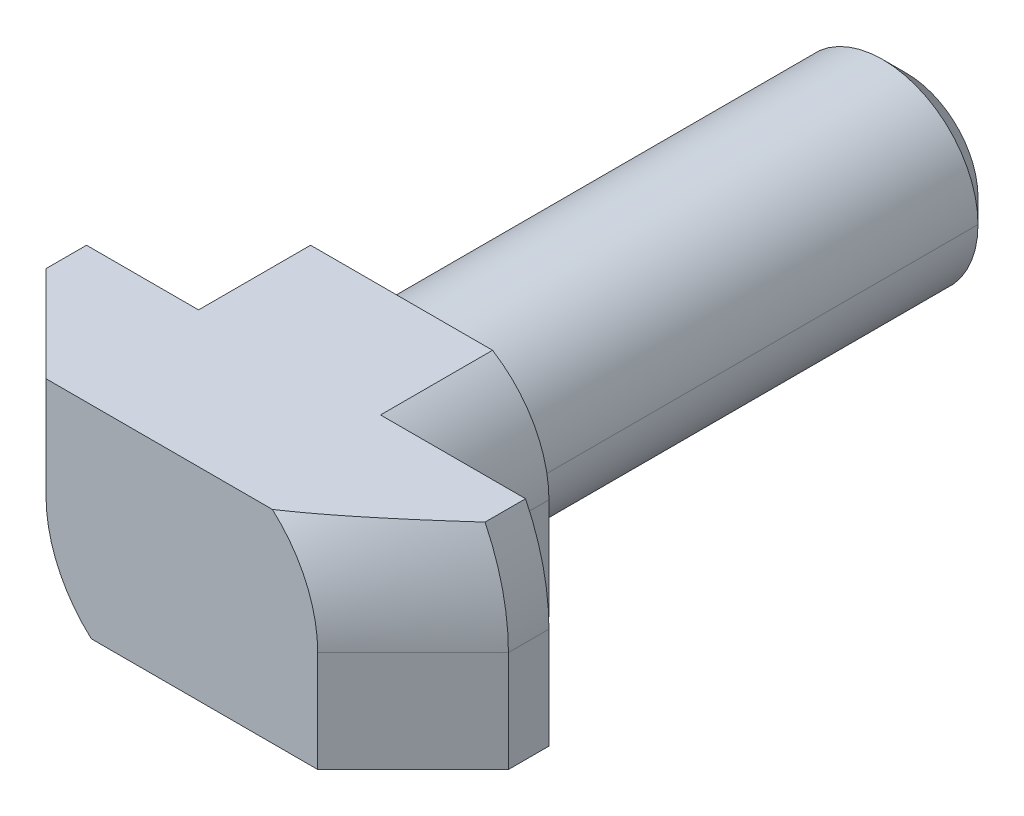
ISO-10303-21;
HEADER;
FILE_DESCRIPTION(('STEP AP214'),'2;1');
FILE_NAME('part.step','',(''),(''),'','','');
FILE_SCHEMA(('AUTOMOTIVE_DESIGN { 1 0 10303 214 1 1 1 1 }'));
ENDSEC;
DATA;
#1=APPLICATION_CONTEXT('core data for automotive mechanical design processes');
#2=APPLICATION_PROTOCOL_DEFINITION('international standard','automotive_design',2000,#1);
#3=PRODUCT_CONTEXT('',#1,'mechanical');
#4=PRODUCT('Part','Part','',(#3));
#5=PRODUCT_RELATED_PRODUCT_CATEGORY('part','',(#4));
#6=PRODUCT_DEFINITION_FORMATION('','',#4);
#7=PRODUCT_DEFINITION_CONTEXT('part definition',#1,'design');
#8=PRODUCT_DEFINITION('design','',#6,#7);
#9=PRODUCT_DEFINITION_SHAPE('','',#8);
#10=(LENGTH_UNIT() NAMED_UNIT(*) SI_UNIT(.MILLI.,.METRE.));
#11=(NAMED_UNIT(*) PLANE_ANGLE_UNIT() SI_UNIT($,.RADIAN.));
#12=(NAMED_UNIT(*) SI_UNIT($,.STERADIAN.) SOLID_ANGLE_UNIT());
#13=UNCERTAINTY_MEASURE_WITH_UNIT(LENGTH_MEASURE(1.E-05),#10,'distance_accuracy_value','');
#14=(GEOMETRIC_REPRESENTATION_CONTEXT(3) GLOBAL_UNCERTAINTY_ASSIGNED_CONTEXT((#13)) GLOBAL_UNIT_ASSIGNED_CONTEXT((#10,
#11,#12)) REPRESENTATION_CONTEXT('',''));
#15=CARTESIAN_POINT('',(0.,0.,0.));
#16=DIRECTION('',(0.,0.,1.));
#17=DIRECTION('',(1.,0.,0.));
#18=AXIS2_PLACEMENT_3D('',#15,#16,#17);
#19=CARTESIAN_POINT('',(0.,0.,-3.5));
#20=DIRECTION('',(0.,0.,-1.));
#21=DIRECTION('',(1.,0.,0.));
#22=AXIS2_PLACEMENT_3D('',#19,#20,#21);
#23=CYLINDRICAL_SURFACE('',#22,4.);
#24=DIRECTION('',(0.,0.,-1.));
#25=VECTOR('',#24,1.);
#26=CARTESIAN_POINT('',(4.,0.,-4.7));
#27=LINE('',#26,#25);
#28=CARTESIAN_POINT('',(4.,0.,-4.7));
#29=VERTEX_POINT('',#28);
#30=CARTESIAN_POINT('',(4.,0.,-23.7));
#31=VERTEX_POINT('',#30);
#32=EDGE_CURVE('E286',#29,#31,#27,.T.);
#33=ORIENTED_EDGE('',*,*,#32,.T.);
#34=CARTESIAN_POINT('',(0.,0.,-23.7));
#35=DIRECTION('',(0.,0.,-1.));
#36=DIRECTION('',(-1.,0.,0.));
#37=AXIS2_PLACEMENT_3D('',#34,#35,#36);
#38=CIRCLE('',#37,4.);
#39=CARTESIAN_POINT('',(-4.,0.,-23.7));
#40=VERTEX_POINT('',#39);
#41=EDGE_CURVE('E56',#31,#40,#38,.F.);
#42=ORIENTED_EDGE('',*,*,#41,.T.);
#43=DIRECTION('',(0.,0.,-1.));
#44=VECTOR('',#43,1.);
#45=CARTESIAN_POINT('',(-4.,0.,-4.7));
#46=LINE('',#45,#44);
#47=CARTESIAN_POINT('',(-4.,0.,-4.7));
#48=VERTEX_POINT('',#47);
#49=EDGE_CURVE('E281',#48,#40,#46,.T.);
#50=ORIENTED_EDGE('',*,*,#49,.F.);
#51=CARTESIAN_POINT('',(0.,0.,-4.7));
#52=DIRECTION('',(0.,0.,1.));
#53=DIRECTION('',(1.,0.,0.));
#54=AXIS2_PLACEMENT_3D('',#51,#52,#53);
#55=CIRCLE('',#54,4.);
#56=EDGE_CURVE('E284',#29,#48,#55,.T.);
#57=ORIENTED_EDGE('',*,*,#56,.F.);
#58=EDGE_LOOP('',(#33,#42,#50,#57));
#59=FACE_BOUND('',#58,.T.);
#60=ADVANCED_FACE('F46',(#59),#23,.T.);
#61=CARTESIAN_POINT('',(0.,0.,-3.5));
#62=DIRECTION('',(0.,0.,-1.));
#63=DIRECTION('',(1.,0.,0.));
#64=AXIS2_PLACEMENT_3D('',#61,#62,#63);
#65=CYLINDRICAL_SURFACE('',#64,4.);
#66=ORIENTED_EDGE('',*,*,#49,.T.);
#67=CARTESIAN_POINT('',(0.,0.,-23.7));
#68=DIRECTION('',(0.,0.,-1.));
#69=DIRECTION('',(-1.,0.,0.));
#70=AXIS2_PLACEMENT_3D('',#67,#68,#69);
#71=CIRCLE('',#70,4.);
#72=EDGE_CURVE('E13',#40,#31,#71,.F.);
#73=ORIENTED_EDGE('',*,*,#72,.T.);
#74=ORIENTED_EDGE('',*,*,#32,.F.);
#75=CARTESIAN_POINT('',(0.,0.,-4.7));
#76=DIRECTION('',(0.,0.,1.));
#77=DIRECTION('',(1.,0.,0.));
#78=AXIS2_PLACEMENT_3D('',#75,#76,#77);
#79=CIRCLE('',#78,4.);
#80=EDGE_CURVE('E285',#48,#29,#79,.T.);
#81=ORIENTED_EDGE('',*,*,#80,.F.);
#82=EDGE_LOOP('',(#66,#73,#74,#81));
#83=FACE_BOUND('',#82,.T.);
#84=ADVANCED_FACE('F419',(#83),#65,.T.);
#85=CARTESIAN_POINT('',(-5.,-4.25,-3.5));
#86=DIRECTION('',(-1.,0.,0.));
#87=DIRECTION('',(0.,0.,1.));
#88=AXIS2_PLACEMENT_3D('',#85,#86,#87);
#89=PLANE('',#88);
#90=DIRECTION('',(0.,0.,1.));
#91=VECTOR('',#90,1.);
#92=CARTESIAN_POINT('',(-5.,4.25,-1.75));
#93=LINE('',#92,#91);
#94=CARTESIAN_POINT('',(-5.,4.25,-4.7));
#95=VERTEX_POINT('',#94);
#96=CARTESIAN_POINT('',(-5.,4.25,0.));
#97=VERTEX_POINT('',#96);
#98=EDGE_CURVE('E252',#95,#97,#93,.T.);
#99=ORIENTED_EDGE('',*,*,#98,.F.);
#100=DIRECTION('',(0.,1.,0.));
#101=VECTOR('',#100,1.);
#102=CARTESIAN_POINT('',(-5.,-4.25,-4.7));
#103=LINE('',#102,#101);
#104=CARTESIAN_POINT('',(-5.,0.,-4.7));
#105=VERTEX_POINT('',#104);
#106=EDGE_CURVE('E709',#105,#95,#103,.T.);
#107=ORIENTED_EDGE('',*,*,#106,.F.);
#108=DIRECTION('',(0.,0.,-1.));
#109=VECTOR('',#108,1.);
#110=CARTESIAN_POINT('',(-5.,0.,-3.96));
#111=LINE('',#110,#109);
#112=CARTESIAN_POINT('',(-5.,0.,0.));
#113=VERTEX_POINT('',#112);
#114=EDGE_CURVE('E266',#113,#105,#111,.T.);
#115=ORIENTED_EDGE('',*,*,#114,.F.);
#116=DIRECTION('',(0.,-1.,0.));
#117=VECTOR('',#116,1.);
#118=CARTESIAN_POINT('',(-5.,-4.25,0.));
#119=LINE('',#118,#117);
#120=EDGE_CURVE('E274',#97,#113,#119,.T.);
#121=ORIENTED_EDGE('',*,*,#120,.F.);
#122=EDGE_LOOP('',(#99,#107,#115,#121));
#123=FACE_BOUND('',#122,.T.);
#124=ADVANCED_FACE('F426',(#123),#89,.T.);
#125=CARTESIAN_POINT('',(-9.7,-4.25,0.));
#126=DIRECTION('',(-1.,0.,0.));
#127=DIRECTION('',(0.,0.,1.));
#128=AXIS2_PLACEMENT_3D('',#125,#126,#127);
#129=PLANE('',#128);
#130=DIRECTION('',(0.,0.,1.));
#131=VECTOR('',#130,1.);
#132=CARTESIAN_POINT('',(-9.7,4.25,0.));
#133=LINE('',#132,#131);
#134=CARTESIAN_POINT('',(-9.7,4.25,0.));
#135=VERTEX_POINT('',#134);
#136=CARTESIAN_POINT('',(-9.7,4.25,1.7));
#137=VERTEX_POINT('',#136);
#138=EDGE_CURVE('E244',#135,#137,#133,.T.);
#139=ORIENTED_EDGE('',*,*,#138,.F.);
#140=DIRECTION('',(0.,1.,0.));
#141=VECTOR('',#140,1.);
#142=CARTESIAN_POINT('',(-9.7,-4.25,0.));
#143=LINE('',#142,#141);
#144=CARTESIAN_POINT('',(-9.7,0.,0.));
#145=VERTEX_POINT('',#144);
#146=EDGE_CURVE('E365',#145,#135,#143,.T.);
#147=ORIENTED_EDGE('',*,*,#146,.F.);
#148=DIRECTION('',(0.,0.,-1.));
#149=VECTOR('',#148,1.);
#150=CARTESIAN_POINT('',(-9.7,0.,-3.96));
#151=LINE('',#150,#149);
#152=CARTESIAN_POINT('',(-9.7,0.,1.7));
#153=VERTEX_POINT('',#152);
#154=EDGE_CURVE('E341',#153,#145,#151,.T.);
#155=ORIENTED_EDGE('',*,*,#154,.F.);
#156=DIRECTION('',(0.,-1.,0.));
#157=VECTOR('',#156,1.);
#158=CARTESIAN_POINT('',(-9.7,-4.25,1.7));
#159=LINE('',#158,#157);
#160=EDGE_CURVE('E293',#137,#153,#159,.T.);
#161=ORIENTED_EDGE('',*,*,#160,.F.);
#162=EDGE_LOOP('',(#139,#147,#155,#161));
#163=FACE_BOUND('',#162,.T.);
#164=ADVANCED_FACE('F471',(#163),#129,.T.);
#165=CARTESIAN_POINT('',(-9.7,-4.25,1.7));
#166=DIRECTION('',(-0.707106781186547,0.,0.707106781186548));
#167=DIRECTION('',(0.,1.,0.));
#168=AXIS2_PLACEMENT_3D('',#165,#166,#167);
#169=PLANE('',#168);
#170=DIRECTION('',(0.707106781186548,0.,0.707106781186547));
#171=VECTOR('',#170,1.);
#172=CARTESIAN_POINT('',(-7.7,4.25,3.7));
#173=LINE('',#172,#171);
#174=CARTESIAN_POINT('',(-5.7,4.25,5.7));
#175=VERTEX_POINT('',#174);
#176=EDGE_CURVE('E238',#137,#175,#173,.T.);
#177=ORIENTED_EDGE('',*,*,#176,.F.);
#178=ORIENTED_EDGE('',*,*,#160,.T.);
#179=DIRECTION('',(-0.707106781186548,0.,-0.707106781186547));
#180=VECTOR('',#179,1.);
#181=CARTESIAN_POINT('',(-9.7848562079907,0.,1.61514379200929));
#182=LINE('',#181,#180);
#183=CARTESIAN_POINT('',(-5.7,0.,5.7));
#184=VERTEX_POINT('',#183);
#185=EDGE_CURVE('E329',#184,#153,#182,.T.);
#186=ORIENTED_EDGE('',*,*,#185,.F.);
#187=DIRECTION('',(0.,-1.,0.));
#188=VECTOR('',#187,1.);
#189=CARTESIAN_POINT('',(-5.7,-4.25,5.7));
#190=LINE('',#189,#188);
#191=EDGE_CURVE('E306',#175,#184,#190,.T.);
#192=ORIENTED_EDGE('',*,*,#191,.F.);
#193=EDGE_LOOP('',(#177,#178,#186,#192));
#194=FACE_BOUND('',#193,.T.);
#195=ADVANCED_FACE('F466',(#194),#169,.T.);
#196=CARTESIAN_POINT('',(0.,-4.25,0.));
#197=DIRECTION('',(0.,1.,0.));
#198=DIRECTION('',(0.,0.,-1.));
#199=AXIS2_PLACEMENT_3D('',#196,#197,#198);
#200=PLANE('',#199);
#201=DIRECTION('',(1.,0.,0.));
#202=VECTOR('',#201,1.);
#203=CARTESIAN_POINT('',(-2.5,-4.25,0.));
#204=LINE('',#203,#202);
#205=CARTESIAN_POINT('',(-8.71937497760017,-4.25,0.));
#206=VERTEX_POINT('',#205);
#207=CARTESIAN_POINT('',(-2.63391343821318,-4.25,0.));
#208=VERTEX_POINT('',#207);
#209=EDGE_CURVE('E277',#206,#208,#204,.T.);
#210=ORIENTED_EDGE('',*,*,#209,.T.);
#211=DIRECTION('',(0.,0.,1.));
#212=VECTOR('',#211,1.);
#213=CARTESIAN_POINT('',(-2.63391343821318,-4.25,-3.96));
#214=LINE('',#213,#212);
#215=CARTESIAN_POINT('',(-2.63391343821318,-4.25,-4.7));
#216=VERTEX_POINT('',#215);
#217=EDGE_CURVE('E301',#216,#208,#214,.T.);
#218=ORIENTED_EDGE('',*,*,#217,.F.);
#219=DIRECTION('',(-1.,0.,0.));
#220=VECTOR('',#219,1.);
#221=CARTESIAN_POINT('',(-2.125,-4.25,-4.7));
#222=LINE('',#221,#220);
#223=CARTESIAN_POINT('',(5.,-4.25,-4.7));
#224=VERTEX_POINT('',#223);
#225=EDGE_CURVE('E267',#224,#216,#222,.T.);
#226=ORIENTED_EDGE('',*,*,#225,.F.);
#227=DIRECTION('',(0.,0.,1.));
#228=VECTOR('',#227,1.);
#229=CARTESIAN_POINT('',(5.,-4.25,0.));
#230=LINE('',#229,#228);
#231=CARTESIAN_POINT('',(5.,-4.25,0.));
#232=VERTEX_POINT('',#231);
#233=EDGE_CURVE('E260',#224,#232,#230,.T.);
#234=ORIENTED_EDGE('',*,*,#233,.T.);
#235=DIRECTION('',(1.,0.,0.));
#236=VECTOR('',#235,1.);
#237=CARTESIAN_POINT('',(4.85,-4.25,0.));
#238=LINE('',#237,#236);
#239=CARTESIAN_POINT('',(9.7,-4.25,0.));
#240=VERTEX_POINT('',#239);
#241=EDGE_CURVE('E314',#232,#240,#238,.T.);
#242=ORIENTED_EDGE('',*,*,#241,.T.);
#243=DIRECTION('',(0.,0.,1.));
#244=VECTOR('',#243,1.);
#245=CARTESIAN_POINT('',(9.7,-4.25,0.85));
#246=LINE('',#245,#244);
#247=CARTESIAN_POINT('',(9.7,-4.25,1.7));
#248=VERTEX_POINT('',#247);
#249=EDGE_CURVE('E272',#240,#248,#246,.T.);
#250=ORIENTED_EDGE('',*,*,#249,.T.);
#251=DIRECTION('',(-0.707106781186548,0.,0.707106781186547));
#252=VECTOR('',#251,1.);
#253=CARTESIAN_POINT('',(5.7,-4.25,5.7));
#254=LINE('',#253,#252);
#255=CARTESIAN_POINT('',(5.7,-4.25,5.7));
#256=VERTEX_POINT('',#255);
#257=EDGE_CURVE('E273',#248,#256,#254,.T.);
#258=ORIENTED_EDGE('',*,*,#257,.T.);
#259=DIRECTION('',(-1.,0.,0.));
#260=VECTOR('',#259,1.);
#261=CARTESIAN_POINT('',(-2.85,-4.25,5.7));
#262=LINE('',#261,#260);
#263=CARTESIAN_POINT('',(-3.79835490706173,-4.25,5.7));
#264=VERTEX_POINT('',#263);
#265=EDGE_CURVE('E309',#256,#264,#262,.T.);
#266=ORIENTED_EDGE('',*,*,#265,.T.);
#267=CARTESIAN_POINT('',(-8.71937497760017,-4.25,1.70000000000001));
#268=CARTESIAN_POINT('',(-5.61977142667658,-4.25,4.48624800437153));
#269=CARTESIAN_POINT('',(-3.79835490706174,-4.25,5.70000000000001));
#270=(BOUNDED_CURVE() B_SPLINE_CURVE(2,(#267,#268,#269),.UNSPECIFIED.,.F.,
.F.) B_SPLINE_CURVE_WITH_KNOTS((3,3),(0.0541392628478091,6.38606709110727),
.UNSPECIFIED.) CURVE() GEOMETRIC_REPRESENTATION_ITEM() RATIONAL_B_SPLINE_CURVE((1.00096654090197,
1.05701422484958,1.00222486847609)) REPRESENTATION_ITEM(''));
#271=CARTESIAN_POINT('',(-8.71937497760017,-4.25,1.7));
#272=VERTEX_POINT('',#271);
#273=EDGE_CURVE('E323',#272,#264,#270,.T.);
#274=ORIENTED_EDGE('',*,*,#273,.F.);
#275=DIRECTION('',(0.,0.,1.));
#276=VECTOR('',#275,1.);
#277=CARTESIAN_POINT('',(-8.71937497760017,-4.25,-3.96));
#278=LINE('',#277,#276);
#279=EDGE_CURVE('E250',#206,#272,#278,.T.);
#280=ORIENTED_EDGE('',*,*,#279,.F.);
#281=EDGE_LOOP('',(#210,#218,#226,#234,#242,#250,#258,#266,#274,#280));
#282=FACE_BOUND('',#281,.T.);
#283=ADVANCED_FACE('F470',(#282),#200,.F.);
#284=CARTESIAN_POINT('',(9.7,-4.25,1.7));
#285=DIRECTION('',(1.,0.,0.));
#286=DIRECTION('',(0.,1.,0.));
#287=AXIS2_PLACEMENT_3D('',#284,#285,#286);
#288=PLANE('',#287);
#289=ORIENTED_EDGE('',*,*,#249,.F.);
#290=DIRECTION('',(0.,-1.,0.));
#291=VECTOR('',#290,1.);
#292=CARTESIAN_POINT('',(9.7,-4.25,0.));
#293=LINE('',#292,#291);
#294=CARTESIAN_POINT('',(9.7,0.,0.));
#295=VERTEX_POINT('',#294);
#296=EDGE_CURVE('E305',#295,#240,#293,.T.);
#297=ORIENTED_EDGE('',*,*,#296,.F.);
#298=DIRECTION('',(0.,0.,-1.));
#299=VECTOR('',#298,1.);
#300=CARTESIAN_POINT('',(9.7,0.,-3.96));
#301=LINE('',#300,#299);
#302=CARTESIAN_POINT('',(9.7,0.,1.7));
#303=VERTEX_POINT('',#302);
#304=EDGE_CURVE('E219',#303,#295,#301,.T.);
#305=ORIENTED_EDGE('',*,*,#304,.F.);
#306=DIRECTION('',(0.,-1.,0.));
#307=VECTOR('',#306,1.);
#308=CARTESIAN_POINT('',(9.7,-4.25,1.7));
#309=LINE('',#308,#307);
#310=EDGE_CURVE('E268',#303,#248,#309,.T.);
#311=ORIENTED_EDGE('',*,*,#310,.T.);
#312=EDGE_LOOP('',(#289,#297,#305,#311));
#313=FACE_BOUND('',#312,.T.);
#314=ADVANCED_FACE('F537',(#313),#288,.T.);
#315=CARTESIAN_POINT('',(5.7,-4.25,5.7));
#316=DIRECTION('',(0.707106781186547,0.,0.707106781186548));
#317=DIRECTION('',(0.,-1.,0.));
#318=AXIS2_PLACEMENT_3D('',#315,#316,#317);
#319=PLANE('',#318);
#320=ORIENTED_EDGE('',*,*,#257,.F.);
#321=ORIENTED_EDGE('',*,*,#310,.F.);
#322=DIRECTION('',(0.707106781186548,0.,-0.707106781186547));
#323=VECTOR('',#322,1.);
#324=CARTESIAN_POINT('',(9.78485620799071,0.,1.61514379200929));
#325=LINE('',#324,#323);
#326=CARTESIAN_POINT('',(5.7,0.,5.7));
#327=VERTEX_POINT('',#326);
#328=EDGE_CURVE('E215',#327,#303,#325,.T.);
#329=ORIENTED_EDGE('',*,*,#328,.F.);
#330=DIRECTION('',(0.,-1.,0.));
#331=VECTOR('',#330,1.);
#332=CARTESIAN_POINT('',(5.7,-4.25,5.7));
#333=LINE('',#332,#331);
#334=EDGE_CURVE('E344',#327,#256,#333,.T.);
#335=ORIENTED_EDGE('',*,*,#334,.T.);
#336=EDGE_LOOP('',(#320,#321,#329,#335));
#337=FACE_BOUND('',#336,.T.);
#338=ADVANCED_FACE('F533',(#337),#319,.T.);
#339=CARTESIAN_POINT('',(0.,0.,1.6151437920093));
#340=DIRECTION('',(0.,0.,-1.));
#341=DIRECTION('',(-1.,0.,0.));
#342=AXIS2_PLACEMENT_3D('',#339,#340,#341);
#343=CONICAL_SURFACE('',#342,9.78485620799071,0.785398163397449);
#344=ORIENTED_EDGE('',*,*,#328,.T.);
#345=CARTESIAN_POINT('',(0.,0.,1.7));
#346=DIRECTION('',(0.,0.,1.));
#347=DIRECTION('',(-1.,0.,0.));
#348=AXIS2_PLACEMENT_3D('',#345,#346,#347);
#349=CIRCLE('',#348,9.7);
#350=CARTESIAN_POINT('',(8.71937497760017,4.25,1.7));
#351=VERTEX_POINT('',#350);
#352=EDGE_CURVE('E208',#303,#351,#349,.T.);
#353=ORIENTED_EDGE('',*,*,#352,.T.);
#354=CARTESIAN_POINT('',(8.71937497760019,4.25,1.70000000000002));
#355=CARTESIAN_POINT('',(5.61977142667659,4.25,4.48624800437153));
#356=CARTESIAN_POINT('',(3.79835490706176,4.25,5.7));
#357=(BOUNDED_CURVE() B_SPLINE_CURVE(2,(#354,#355,#356),.UNSPECIFIED.,.F.,
.F.) B_SPLINE_CURVE_WITH_KNOTS((3,3),(0.0541392628478195,6.38606709110726),
.UNSPECIFIED.) CURVE() GEOMETRIC_REPRESENTATION_ITEM() RATIONAL_B_SPLINE_CURVE((1.00096654090197,
1.05701422484956,1.00222486847609)) REPRESENTATION_ITEM(''));
#358=CARTESIAN_POINT('',(3.79835490706176,4.25,5.7));
#359=VERTEX_POINT('',#358);
#360=EDGE_CURVE('E213',#351,#359,#357,.T.);
#361=ORIENTED_EDGE('',*,*,#360,.T.);
#362=CARTESIAN_POINT('',(0.,0.,5.7));
#363=DIRECTION('',(0.,0.,1.));
#364=DIRECTION('',(-1.,0.,0.));
#365=AXIS2_PLACEMENT_3D('',#362,#363,#364);
#366=CIRCLE('',#365,5.7);
#367=EDGE_CURVE('E348',#327,#359,#366,.T.);
#368=ORIENTED_EDGE('',*,*,#367,.F.);
#369=EDGE_LOOP('',(#344,#353,#361,#368));
#370=FACE_BOUND('',#369,.T.);
#371=ADVANCED_FACE('F210',(#370),#343,.T.);
#372=CARTESIAN_POINT('',(0.,0.,-3.96));
#373=DIRECTION('',(0.,0.,1.));
#374=DIRECTION('',(-1.,0.,0.));
#375=AXIS2_PLACEMENT_3D('',#372,#373,#374);
#376=CYLINDRICAL_SURFACE('',#375,9.7);
#377=ORIENTED_EDGE('',*,*,#304,.T.);
#378=CARTESIAN_POINT('',(0.,0.,0.));
#379=DIRECTION('',(0.,0.,-1.));
#380=DIRECTION('',(-1.,0.,0.));
#381=AXIS2_PLACEMENT_3D('',#378,#379,#380);
#382=CIRCLE('',#381,9.7);
#383=CARTESIAN_POINT('',(8.71937497760017,4.25,0.));
#384=VERTEX_POINT('',#383);
#385=EDGE_CURVE('E225',#384,#295,#382,.T.);
#386=ORIENTED_EDGE('',*,*,#385,.F.);
#387=DIRECTION('',(0.,0.,1.));
#388=VECTOR('',#387,1.);
#389=CARTESIAN_POINT('',(8.71937497760017,4.25,-3.96));
#390=LINE('',#389,#388);
#391=EDGE_CURVE('E222',#384,#351,#390,.T.);
#392=ORIENTED_EDGE('',*,*,#391,.T.);
#393=ORIENTED_EDGE('',*,*,#352,.F.);
#394=EDGE_LOOP('',(#377,#386,#392,#393));
#395=FACE_BOUND('',#394,.T.);
#396=ADVANCED_FACE('F223',(#395),#376,.T.);
#397=CARTESIAN_POINT('',(9.7,-4.25,0.));
#398=DIRECTION('',(0.,0.,-1.));
#399=DIRECTION('',(0.,-1.,0.));
#400=AXIS2_PLACEMENT_3D('',#397,#398,#399);
#401=PLANE('',#400);
#402=ORIENTED_EDGE('',*,*,#296,.T.);
#403=ORIENTED_EDGE('',*,*,#241,.F.);
#404=DIRECTION('',(0.,1.,0.));
#405=VECTOR('',#404,1.);
#406=CARTESIAN_POINT('',(5.,-4.25,0.));
#407=LINE('',#406,#405);
#408=CARTESIAN_POINT('',(5.,0.,0.));
#409=VERTEX_POINT('',#408);
#410=EDGE_CURVE('E302',#232,#409,#407,.T.);
#411=ORIENTED_EDGE('',*,*,#410,.T.);
#412=CARTESIAN_POINT('',(0.,0.,0.));
#413=DIRECTION('',(0.,0.,1.));
#414=DIRECTION('',(-1.,0.,0.));
#415=AXIS2_PLACEMENT_3D('',#412,#413,#414);
#416=CIRCLE('',#415,5.);
#417=CARTESIAN_POINT('',(2.63391343821319,4.25,0.));
#418=VERTEX_POINT('',#417);
#419=EDGE_CURVE('E261',#409,#418,#416,.T.);
#420=ORIENTED_EDGE('',*,*,#419,.T.);
#421=DIRECTION('',(-1.,0.,0.));
#422=VECTOR('',#421,1.);
#423=CARTESIAN_POINT('',(4.85,4.25,0.));
#424=LINE('',#423,#422);
#425=EDGE_CURVE('E230',#384,#418,#424,.T.);
#426=ORIENTED_EDGE('',*,*,#425,.F.);
#427=ORIENTED_EDGE('',*,*,#385,.T.);
#428=EDGE_LOOP('',(#402,#403,#411,#420,#426,#427));
#429=FACE_BOUND('',#428,.T.);
#430=ADVANCED_FACE('F506',(#429),#401,.T.);
#431=CARTESIAN_POINT('',(5.,-4.25,0.));
#432=DIRECTION('',(1.,0.,0.));
#433=DIRECTION('',(0.,1.,0.));
#434=AXIS2_PLACEMENT_3D('',#431,#432,#433);
#435=PLANE('',#434);
#436=ORIENTED_EDGE('',*,*,#233,.F.);
#437=DIRECTION('',(0.,-1.,0.));
#438=VECTOR('',#437,1.);
#439=CARTESIAN_POINT('',(5.,-4.25,-4.7));
#440=LINE('',#439,#438);
#441=CARTESIAN_POINT('',(5.,0.,-4.7));
#442=VERTEX_POINT('',#441);
#443=EDGE_CURVE('E336',#442,#224,#440,.T.);
#444=ORIENTED_EDGE('',*,*,#443,.F.);
#445=DIRECTION('',(0.,0.,-1.));
#446=VECTOR('',#445,1.);
#447=CARTESIAN_POINT('',(5.,0.,-3.96));
#448=LINE('',#447,#446);
#449=EDGE_CURVE('E257',#409,#442,#448,.T.);
#450=ORIENTED_EDGE('',*,*,#449,.F.);
#451=ORIENTED_EDGE('',*,*,#410,.F.);
#452=EDGE_LOOP('',(#436,#444,#450,#451));
#453=FACE_BOUND('',#452,.T.);
#454=ADVANCED_FACE('F511',(#453),#435,.T.);
#455=CARTESIAN_POINT('',(0.,0.,-3.96));
#456=DIRECTION('',(0.,0.,1.));
#457=DIRECTION('',(-1.,0.,0.));
#458=AXIS2_PLACEMENT_3D('',#455,#456,#457);
#459=CYLINDRICAL_SURFACE('',#458,5.);
#460=ORIENTED_EDGE('',*,*,#419,.F.);
#461=ORIENTED_EDGE('',*,*,#449,.T.);
#462=CARTESIAN_POINT('',(0.,0.,-4.7));
#463=DIRECTION('',(0.,0.,-1.));
#464=DIRECTION('',(-1.,0.,0.));
#465=AXIS2_PLACEMENT_3D('',#462,#463,#464);
#466=CIRCLE('',#465,5.);
#467=CARTESIAN_POINT('',(2.63391343821319,4.25,-4.7));
#468=VERTEX_POINT('',#467);
#469=EDGE_CURVE('E340',#468,#442,#466,.T.);
#470=ORIENTED_EDGE('',*,*,#469,.F.);
#471=DIRECTION('',(0.,0.,1.));
#472=VECTOR('',#471,1.);
#473=CARTESIAN_POINT('',(2.63391343821319,4.25,-3.96));
#474=LINE('',#473,#472);
#475=EDGE_CURVE('E289',#468,#418,#474,.T.);
#476=ORIENTED_EDGE('',*,*,#475,.T.);
#477=EDGE_LOOP('',(#460,#461,#470,#476));
#478=FACE_BOUND('',#477,.T.);
#479=ADVANCED_FACE('F515',(#478),#459,.T.);
#480=CARTESIAN_POINT('',(0.,4.25,0.));
#481=DIRECTION('',(0.,1.,0.));
#482=DIRECTION('',(0.,0.,-1.));
#483=AXIS2_PLACEMENT_3D('',#480,#481,#482);
#484=PLANE('',#483);
#485=DIRECTION('',(1.,0.,0.));
#486=VECTOR('',#485,1.);
#487=CARTESIAN_POINT('',(-2.125,4.25,-4.7));
#488=LINE('',#487,#486);
#489=EDGE_CURVE('E379',#95,#468,#488,.T.);
#490=ORIENTED_EDGE('',*,*,#489,.F.);
#491=ORIENTED_EDGE('',*,*,#98,.T.);
#492=DIRECTION('',(1.,0.,0.));
#493=VECTOR('',#492,1.);
#494=CARTESIAN_POINT('',(-2.5,4.25,0.));
#495=LINE('',#494,#493);
#496=EDGE_CURVE('E278',#135,#97,#495,.T.);
#497=ORIENTED_EDGE('',*,*,#496,.F.);
#498=ORIENTED_EDGE('',*,*,#138,.T.);
#499=ORIENTED_EDGE('',*,*,#176,.T.);
#500=DIRECTION('',(1.,0.,0.));
#501=VECTOR('',#500,1.);
#502=CARTESIAN_POINT('',(-2.85,4.25,5.7));
#503=LINE('',#502,#501);
#504=EDGE_CURVE('E235',#175,#359,#503,.T.);
#505=ORIENTED_EDGE('',*,*,#504,.T.);
#506=ORIENTED_EDGE('',*,*,#360,.F.);
#507=ORIENTED_EDGE('',*,*,#391,.F.);
#508=ORIENTED_EDGE('',*,*,#425,.T.);
#509=ORIENTED_EDGE('',*,*,#475,.F.);
#510=EDGE_LOOP('',(#490,#491,#497,#498,#499,#505,#506,#507,#508,#509));
#511=FACE_BOUND('',#510,.T.);
#512=ADVANCED_FACE('F233',(#511),#484,.T.);
#513=CARTESIAN_POINT('',(-5.7,-4.25,5.7));
#514=DIRECTION('',(0.,0.,1.));
#515=DIRECTION('',(0.,-1.,0.));
#516=AXIS2_PLACEMENT_3D('',#513,#514,#515);
#517=PLANE('',#516);
#518=ORIENTED_EDGE('',*,*,#191,.T.);
#519=CARTESIAN_POINT('',(0.,0.,5.7));
#520=DIRECTION('',(0.,0.,1.));
#521=DIRECTION('',(-1.,0.,0.));
#522=AXIS2_PLACEMENT_3D('',#519,#520,#521);
#523=CIRCLE('',#522,5.7);
#524=EDGE_CURVE('E310',#184,#264,#523,.T.);
#525=ORIENTED_EDGE('',*,*,#524,.T.);
#526=ORIENTED_EDGE('',*,*,#265,.F.);
#527=ORIENTED_EDGE('',*,*,#334,.F.);
#528=ORIENTED_EDGE('',*,*,#367,.T.);
#529=ORIENTED_EDGE('',*,*,#504,.F.);
#530=EDGE_LOOP('',(#518,#525,#526,#527,#528,#529));
#531=FACE_BOUND('',#530,.T.);
#532=ADVANCED_FACE('F489',(#531),#517,.T.);
#533=CARTESIAN_POINT('',(0.,0.,1.6151437920093));
#534=DIRECTION('',(0.,0.,-1.));
#535=DIRECTION('',(-1.,0.,0.));
#536=AXIS2_PLACEMENT_3D('',#533,#534,#535);
#537=CONICAL_SURFACE('',#536,9.78485620799071,0.785398163397449);
#538=ORIENTED_EDGE('',*,*,#185,.T.);
#539=CARTESIAN_POINT('',(0.,0.,1.7));
#540=DIRECTION('',(0.,0.,1.));
#541=DIRECTION('',(-1.,0.,0.));
#542=AXIS2_PLACEMENT_3D('',#539,#540,#541);
#543=CIRCLE('',#542,9.7);
#544=EDGE_CURVE('E356',#153,#272,#543,.T.);
#545=ORIENTED_EDGE('',*,*,#544,.T.);
#546=ORIENTED_EDGE('',*,*,#273,.T.);
#547=ORIENTED_EDGE('',*,*,#524,.F.);
#548=EDGE_LOOP('',(#538,#545,#546,#547));
#549=FACE_BOUND('',#548,.T.);
#550=ADVANCED_FACE('F484',(#549),#537,.T.);
#551=CARTESIAN_POINT('',(0.,0.,-3.96));
#552=DIRECTION('',(0.,0.,1.));
#553=DIRECTION('',(-1.,0.,0.));
#554=AXIS2_PLACEMENT_3D('',#551,#552,#553);
#555=CYLINDRICAL_SURFACE('',#554,9.7);
#556=ORIENTED_EDGE('',*,*,#154,.T.);
#557=CARTESIAN_POINT('',(0.,0.,0.));
#558=DIRECTION('',(0.,0.,-1.));
#559=DIRECTION('',(-1.,0.,0.));
#560=AXIS2_PLACEMENT_3D('',#557,#558,#559);
#561=CIRCLE('',#560,9.7);
#562=EDGE_CURVE('E319',#206,#145,#561,.T.);
#563=ORIENTED_EDGE('',*,*,#562,.F.);
#564=ORIENTED_EDGE('',*,*,#279,.T.);
#565=ORIENTED_EDGE('',*,*,#544,.F.);
#566=EDGE_LOOP('',(#556,#563,#564,#565));
#567=FACE_BOUND('',#566,.T.);
#568=ADVANCED_FACE('F488',(#567),#555,.T.);
#569=CARTESIAN_POINT('',(-5.,-4.25,0.));
#570=DIRECTION('',(0.,0.,-1.));
#571=DIRECTION('',(0.,-1.,0.));
#572=AXIS2_PLACEMENT_3D('',#569,#570,#571);
#573=PLANE('',#572);
#574=ORIENTED_EDGE('',*,*,#146,.T.);
#575=ORIENTED_EDGE('',*,*,#496,.T.);
#576=ORIENTED_EDGE('',*,*,#120,.T.);
#577=CARTESIAN_POINT('',(0.,0.,0.));
#578=DIRECTION('',(0.,0.,1.));
#579=DIRECTION('',(-1.,0.,0.));
#580=AXIS2_PLACEMENT_3D('',#577,#578,#579);
#581=CIRCLE('',#580,5.);
#582=EDGE_CURVE('E352',#113,#208,#581,.T.);
#583=ORIENTED_EDGE('',*,*,#582,.T.);
#584=ORIENTED_EDGE('',*,*,#209,.F.);
#585=ORIENTED_EDGE('',*,*,#562,.T.);
#586=EDGE_LOOP('',(#574,#575,#576,#583,#584,#585));
#587=FACE_BOUND('',#586,.T.);
#588=ADVANCED_FACE('F479',(#587),#573,.T.);
#589=CARTESIAN_POINT('',(0.,0.,-3.96));
#590=DIRECTION('',(0.,0.,1.));
#591=DIRECTION('',(-1.,0.,0.));
#592=AXIS2_PLACEMENT_3D('',#589,#590,#591);
#593=CYLINDRICAL_SURFACE('',#592,5.);
#594=ORIENTED_EDGE('',*,*,#114,.T.);
#595=CARTESIAN_POINT('',(0.,0.,-4.7));
#596=DIRECTION('',(0.,0.,-1.));
#597=DIRECTION('',(-1.,0.,0.));
#598=AXIS2_PLACEMENT_3D('',#595,#596,#597);
#599=CIRCLE('',#598,5.);
#600=EDGE_CURVE('E262',#216,#105,#599,.T.);
#601=ORIENTED_EDGE('',*,*,#600,.F.);
#602=ORIENTED_EDGE('',*,*,#217,.T.);
#603=ORIENTED_EDGE('',*,*,#582,.F.);
#604=EDGE_LOOP('',(#594,#601,#602,#603));
#605=FACE_BOUND('',#604,.T.);
#606=ADVANCED_FACE('F414',(#605),#593,.T.);
#607=CARTESIAN_POINT('',(-4.25,-4.25,-4.7));
#608=DIRECTION('',(0.,0.,-1.));
#609=DIRECTION('',(0.,-1.,0.));
#610=AXIS2_PLACEMENT_3D('',#607,#608,#609);
#611=PLANE('',#610);
#612=ORIENTED_EDGE('',*,*,#80,.T.);
#613=ORIENTED_EDGE('',*,*,#56,.T.);
#614=EDGE_LOOP('',(#612,#613));
#615=FACE_BOUND('',#614,.T.);
#616=ORIENTED_EDGE('',*,*,#106,.T.);
#617=ORIENTED_EDGE('',*,*,#489,.T.);
#618=ORIENTED_EDGE('',*,*,#469,.T.);
#619=ORIENTED_EDGE('',*,*,#443,.T.);
#620=ORIENTED_EDGE('',*,*,#225,.T.);
#621=ORIENTED_EDGE('',*,*,#600,.T.);
#622=EDGE_LOOP('',(#616,#617,#618,#619,#620,#621));
#623=FACE_BOUND('',#622,.T.);
#624=ADVANCED_FACE('F407',(#615,#623),#611,.T.);
#625=CARTESIAN_POINT('',(-4.25,-4.25000000000001,-24.7));
#626=DIRECTION('',(0.,0.,-1.));
#627=DIRECTION('',(0.,-1.,0.));
#628=AXIS2_PLACEMENT_3D('',#625,#626,#627);
#629=PLANE('',#628);
#630=CARTESIAN_POINT('',(0.,0.,-24.7));
#631=DIRECTION('',(0.,0.,-1.));
#632=DIRECTION('',(0.,1.,0.));
#633=AXIS2_PLACEMENT_3D('',#630,#631,#632);
#634=CIRCLE('',#633,3.00000000000001);
#635=CARTESIAN_POINT('',(3.00000000000001,0.,-24.7));
#636=VERTEX_POINT('',#635);
#637=CARTESIAN_POINT('',(-3.00000000000001,0.,-24.7));
#638=VERTEX_POINT('',#637);
#639=EDGE_CURVE('E296',#636,#638,#634,.T.);
#640=ORIENTED_EDGE('',*,*,#639,.T.);
#641=CARTESIAN_POINT('',(0.,0.,-24.7));
#642=DIRECTION('',(0.,0.,-1.));
#643=DIRECTION('',(0.,1.,0.));
#644=AXIS2_PLACEMENT_3D('',#641,#642,#643);
#645=CIRCLE('',#644,3.00000000000001);
#646=EDGE_CURVE('E395',#638,#636,#645,.T.);
#647=ORIENTED_EDGE('',*,*,#646,.T.);
#648=EDGE_LOOP('',(#640,#647));
#649=FACE_BOUND('',#648,.T.);
#650=ADVANCED_FACE('F405',(#649),#629,.T.);
#651=CARTESIAN_POINT('',(0.,0.,-24.7));
#652=DIRECTION('',(0.,0.,1.));
#653=DIRECTION('',(1.,0.,0.));
#654=AXIS2_PLACEMENT_3D('',#651,#652,#653);
#655=CONICAL_SURFACE('',#654,3.00000000000001,0.785398163397449);
#656=DIRECTION('',(-0.707106781186548,0.,-0.707106781186547));
#657=VECTOR('',#656,1.);
#658=CARTESIAN_POINT('',(4.,0.,-23.7));
#659=LINE('',#658,#657);
#660=EDGE_CURVE('E399',#31,#636,#659,.T.);
#661=ORIENTED_EDGE('',*,*,#660,.F.);
#662=ORIENTED_EDGE('',*,*,#72,.F.);
#663=DIRECTION('',(-0.707106781186548,0.,0.707106781186547));
#664=VECTOR('',#663,1.);
#665=CARTESIAN_POINT('',(-3.00000000000001,0.,-24.7));
#666=LINE('',#665,#664);
#667=EDGE_CURVE('E51',#638,#40,#666,.T.);
#668=ORIENTED_EDGE('',*,*,#667,.F.);
#669=ORIENTED_EDGE('',*,*,#639,.F.);
#670=EDGE_LOOP('',(#661,#662,#668,#669));
#671=FACE_BOUND('',#670,.T.);
#672=ADVANCED_FACE('F49',(#671),#655,.T.);
#673=CARTESIAN_POINT('',(0.,0.,-24.7));
#674=DIRECTION('',(0.,0.,1.));
#675=DIRECTION('',(1.,0.,0.));
#676=AXIS2_PLACEMENT_3D('',#673,#674,#675);
#677=CONICAL_SURFACE('',#676,3.00000000000001,0.785398163397449);
#678=ORIENTED_EDGE('',*,*,#667,.T.);
#679=ORIENTED_EDGE('',*,*,#41,.F.);
#680=ORIENTED_EDGE('',*,*,#660,.T.);
#681=ORIENTED_EDGE('',*,*,#646,.F.);
#682=EDGE_LOOP('',(#678,#679,#680,#681));
#683=FACE_BOUND('',#682,.T.);
#684=ADVANCED_FACE('F402',(#683),#677,.T.);
#685=CLOSED_SHELL('',(#60,#84,#124,#164,#195,#283,#314,#338,#371,#396,#430,#454,#479,#512,#532,
#550,#568,#588,#606,#624,#650,#672,#684));
#686=MANIFOLD_SOLID_BREP('B2',#685);
#687=ADVANCED_BREP_SHAPE_REPRESENTATION('',(#18,#686),#14);
#688=SHAPE_DEFINITION_REPRESENTATION(#9,#687);
ENDSEC;
END-ISO-10303-21;
